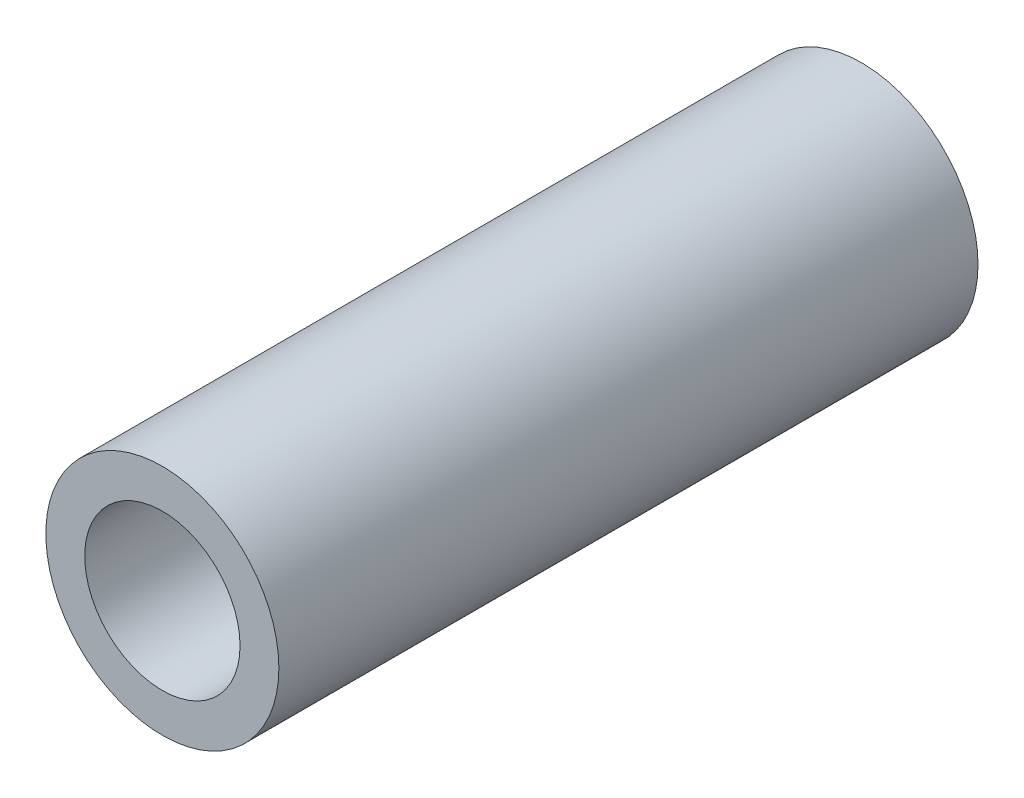
ISO-10303-21;
HEADER;
FILE_DESCRIPTION(('STEP AP214'),'2;1');
FILE_NAME('part.step','',(''),(''),'','','');
FILE_SCHEMA(('AUTOMOTIVE_DESIGN { 1 0 10303 214 1 1 1 1 }'));
ENDSEC;
DATA;
#1=APPLICATION_CONTEXT('core data for automotive mechanical design processes');
#2=APPLICATION_PROTOCOL_DEFINITION('international standard','automotive_design',2000,#1);
#3=PRODUCT_CONTEXT('',#1,'mechanical');
#4=PRODUCT('Part','Part','',(#3));
#5=PRODUCT_RELATED_PRODUCT_CATEGORY('part','',(#4));
#6=PRODUCT_DEFINITION_FORMATION('','',#4);
#7=PRODUCT_DEFINITION_CONTEXT('part definition',#1,'design');
#8=PRODUCT_DEFINITION('design','',#6,#7);
#9=PRODUCT_DEFINITION_SHAPE('','',#8);
#10=(LENGTH_UNIT() NAMED_UNIT(*) SI_UNIT(.MILLI.,.METRE.));
#11=(NAMED_UNIT(*) PLANE_ANGLE_UNIT() SI_UNIT($,.RADIAN.));
#12=(NAMED_UNIT(*) SI_UNIT($,.STERADIAN.) SOLID_ANGLE_UNIT());
#13=UNCERTAINTY_MEASURE_WITH_UNIT(LENGTH_MEASURE(1.E-05),#10,'distance_accuracy_value','');
#14=(GEOMETRIC_REPRESENTATION_CONTEXT(3) GLOBAL_UNCERTAINTY_ASSIGNED_CONTEXT((#13)) GLOBAL_UNIT_ASSIGNED_CONTEXT((#10,
#11,#12)) REPRESENTATION_CONTEXT('',''));
#15=CARTESIAN_POINT('',(0.,0.,0.));
#16=DIRECTION('',(0.,0.,1.));
#17=DIRECTION('',(1.,0.,0.));
#18=AXIS2_PLACEMENT_3D('',#15,#16,#17);
#19=CARTESIAN_POINT('',(0.,0.,18.));
#20=DIRECTION('',(0.,0.,1.));
#21=DIRECTION('',(1.,0.,0.));
#22=AXIS2_PLACEMENT_3D('',#19,#20,#21);
#23=PLANE('',#22);
#24=CARTESIAN_POINT('',(0.,0.,18.));
#25=DIRECTION('',(0.,0.,1.));
#26=DIRECTION('',(1.,0.,0.));
#27=AXIS2_PLACEMENT_3D('',#24,#25,#26);
#28=CIRCLE('',#27,3.);
#29=CARTESIAN_POINT('',(3.,0.,18.));
#30=VERTEX_POINT('',#29);
#31=EDGE_CURVE('E10',#30,#30,#28,.T.);
#32=ORIENTED_EDGE('',*,*,#31,.T.);
#33=EDGE_LOOP('',(#32));
#34=FACE_BOUND('',#33,.T.);
#35=CARTESIAN_POINT('',(0.,0.,18.));
#36=DIRECTION('',(0.,0.,1.));
#37=DIRECTION('',(1.,0.,0.));
#38=AXIS2_PLACEMENT_3D('',#35,#36,#37);
#39=CIRCLE('',#38,2.);
#40=CARTESIAN_POINT('',(2.,0.,18.));
#41=VERTEX_POINT('',#40);
#42=EDGE_CURVE('E50',#41,#41,#39,.T.);
#43=ORIENTED_EDGE('',*,*,#42,.F.);
#44=EDGE_LOOP('',(#43));
#45=FACE_BOUND('',#44,.T.);
#46=ADVANCED_FACE('F37',(#34,#45),#23,.T.);
#47=CARTESIAN_POINT('',(0.,0.,0.));
#48=DIRECTION('',(0.,0.,1.));
#49=DIRECTION('',(1.,0.,0.));
#50=AXIS2_PLACEMENT_3D('',#47,#48,#49);
#51=PLANE('',#50);
#52=CARTESIAN_POINT('',(0.,0.,0.));
#53=DIRECTION('',(0.,0.,1.));
#54=DIRECTION('',(1.,0.,0.));
#55=AXIS2_PLACEMENT_3D('',#52,#53,#54);
#56=CIRCLE('',#55,3.);
#57=CARTESIAN_POINT('',(3.,0.,0.));
#58=VERTEX_POINT('',#57);
#59=EDGE_CURVE('E41',#58,#58,#56,.T.);
#60=ORIENTED_EDGE('',*,*,#59,.F.);
#61=EDGE_LOOP('',(#60));
#62=FACE_BOUND('',#61,.T.);
#63=CARTESIAN_POINT('',(0.,0.,0.));
#64=DIRECTION('',(0.,0.,1.));
#65=DIRECTION('',(1.,0.,0.));
#66=AXIS2_PLACEMENT_3D('',#63,#64,#65);
#67=CIRCLE('',#66,2.);
#68=CARTESIAN_POINT('',(2.,0.,0.));
#69=VERTEX_POINT('',#68);
#70=EDGE_CURVE('E52',#69,#69,#67,.T.);
#71=ORIENTED_EDGE('',*,*,#70,.T.);
#72=EDGE_LOOP('',(#71));
#73=FACE_BOUND('',#72,.T.);
#74=ADVANCED_FACE('F64',(#62,#73),#51,.F.);
#75=CARTESIAN_POINT('',(0.,0.,18.));
#76=DIRECTION('',(0.,0.,-1.));
#77=DIRECTION('',(-1.,0.,0.));
#78=AXIS2_PLACEMENT_3D('',#75,#76,#77);
#79=CYLINDRICAL_SURFACE('',#78,3.);
#80=ORIENTED_EDGE('',*,*,#31,.F.);
#81=EDGE_LOOP('',(#80));
#82=FACE_BOUND('',#81,.T.);
#83=ORIENTED_EDGE('',*,*,#59,.T.);
#84=EDGE_LOOP('',(#83));
#85=FACE_BOUND('',#84,.T.);
#86=ADVANCED_FACE('F39',(#82,#85),#79,.T.);
#87=CARTESIAN_POINT('',(0.,0.,18.));
#88=DIRECTION('',(0.,0.,-1.));
#89=DIRECTION('',(-1.,0.,0.));
#90=AXIS2_PLACEMENT_3D('',#87,#88,#89);
#91=CYLINDRICAL_SURFACE('',#90,2.);
#92=ORIENTED_EDGE('',*,*,#42,.T.);
#93=EDGE_LOOP('',(#92));
#94=FACE_BOUND('',#93,.T.);
#95=ORIENTED_EDGE('',*,*,#70,.F.);
#96=EDGE_LOOP('',(#95));
#97=FACE_BOUND('',#96,.T.);
#98=ADVANCED_FACE('F60',(#94,#97),#91,.F.);
#99=CLOSED_SHELL('',(#46,#74,#86,#98));
#100=MANIFOLD_SOLID_BREP('B2',#99);
#101=ADVANCED_BREP_SHAPE_REPRESENTATION('',(#18,#100),#14);
#102=SHAPE_DEFINITION_REPRESENTATION(#9,#101);
ENDSEC;
END-ISO-10303-21;
